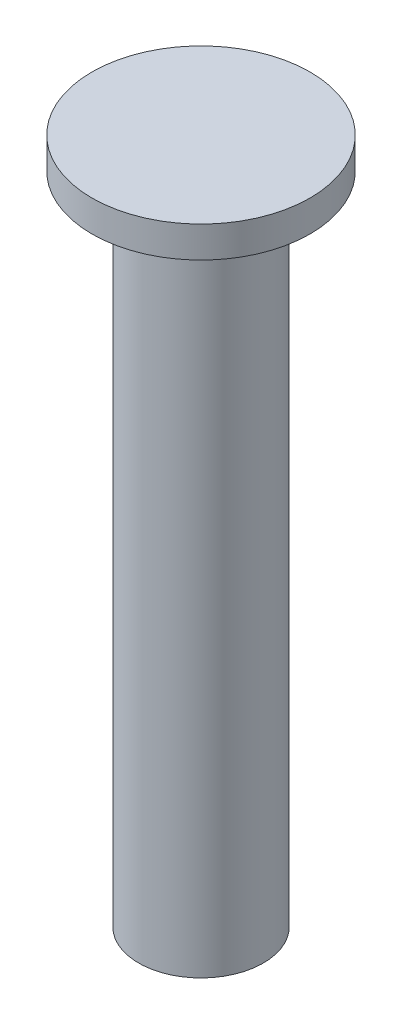
ISO-10303-21;
HEADER;
FILE_DESCRIPTION(('STEP AP214'),'2;1');
FILE_NAME('part.step','',(''),(''),'','','');
FILE_SCHEMA(('AUTOMOTIVE_DESIGN { 1 0 10303 214 1 1 1 1 }'));
ENDSEC;
DATA;
#1=APPLICATION_CONTEXT('core data for automotive mechanical design processes');
#2=APPLICATION_PROTOCOL_DEFINITION('international standard','automotive_design',2000,#1);
#3=PRODUCT_CONTEXT('',#1,'mechanical');
#4=PRODUCT('Part','Part','',(#3));
#5=PRODUCT_RELATED_PRODUCT_CATEGORY('part','',(#4));
#6=PRODUCT_DEFINITION_FORMATION('','',#4);
#7=PRODUCT_DEFINITION_CONTEXT('part definition',#1,'design');
#8=PRODUCT_DEFINITION('design','',#6,#7);
#9=PRODUCT_DEFINITION_SHAPE('','',#8);
#10=(LENGTH_UNIT() NAMED_UNIT(*) SI_UNIT(.MILLI.,.METRE.));
#11=(NAMED_UNIT(*) PLANE_ANGLE_UNIT() SI_UNIT($,.RADIAN.));
#12=(NAMED_UNIT(*) SI_UNIT($,.STERADIAN.) SOLID_ANGLE_UNIT());
#13=UNCERTAINTY_MEASURE_WITH_UNIT(LENGTH_MEASURE(1.E-05),#10,'distance_accuracy_value','');
#14=(GEOMETRIC_REPRESENTATION_CONTEXT(3) GLOBAL_UNCERTAINTY_ASSIGNED_CONTEXT((#13)) GLOBAL_UNIT_ASSIGNED_CONTEXT((#10,
#11,#12)) REPRESENTATION_CONTEXT('',''));
#15=CARTESIAN_POINT('',(0.,0.,0.));
#16=DIRECTION('',(0.,0.,1.));
#17=DIRECTION('',(1.,0.,0.));
#18=AXIS2_PLACEMENT_3D('',#15,#16,#17);
#19=CARTESIAN_POINT('',(0.,21.,0.));
#20=DIRECTION('',(0.,-1.,0.));
#21=DIRECTION('',(0.,0.,-1.));
#22=AXIS2_PLACEMENT_3D('',#19,#20,#21);
#23=CYLINDRICAL_SURFACE('',#22,2.);
#24=CARTESIAN_POINT('',(0.,21.,0.));
#25=DIRECTION('',(0.,1.,0.));
#26=DIRECTION('',(0.,0.,1.));
#27=AXIS2_PLACEMENT_3D('',#24,#25,#26);
#28=CIRCLE('',#27,2.);
#29=CARTESIAN_POINT('',(0.,21.,-2.));
#30=VERTEX_POINT('',#29);
#31=EDGE_CURVE('E10',#30,#30,#28,.T.);
#32=CARTESIAN_POINT('',(0.,0.,0.));
#33=DIRECTION('',(0.,1.,0.));
#34=DIRECTION('',(0.,0.,1.));
#35=AXIS2_PLACEMENT_3D('',#32,#33,#34);
#36=CIRCLE('',#35,2.);
#37=CARTESIAN_POINT('',(0.,0.,-2.));
#38=VERTEX_POINT('',#37);
#39=EDGE_CURVE('E40',#38,#38,#36,.T.);
#40=CARTESIAN_POINT('',(0.,21.,-2.));
#41=CARTESIAN_POINT('',(0.,20.78125,-2.));
#42=CARTESIAN_POINT('',(0.,20.5625,-2.));
#43=CARTESIAN_POINT('',(0.,20.125,-2.));
#44=CARTESIAN_POINT('',(0.,19.90625,-2.));
#45=CARTESIAN_POINT('',(0.,19.46875,-2.));
#46=CARTESIAN_POINT('',(0.,19.25,-2.));
#47=CARTESIAN_POINT('',(0.,18.8125,-2.));
#48=CARTESIAN_POINT('',(0.,18.59375,-2.));
#49=CARTESIAN_POINT('',(0.,18.15625,-2.));
#50=CARTESIAN_POINT('',(0.,17.9375,-2.));
#51=CARTESIAN_POINT('',(0.,17.5,-2.));
#52=CARTESIAN_POINT('',(0.,17.28125,-2.));
#53=CARTESIAN_POINT('',(0.,16.84375,-2.));
#54=CARTESIAN_POINT('',(0.,16.625,-2.));
#55=CARTESIAN_POINT('',(0.,16.1875,-2.));
#56=CARTESIAN_POINT('',(0.,15.96875,-2.));
#57=CARTESIAN_POINT('',(0.,15.53125,-2.));
#58=CARTESIAN_POINT('',(0.,15.3125,-2.));
#59=CARTESIAN_POINT('',(0.,14.875,-2.));
#60=CARTESIAN_POINT('',(0.,14.65625,-2.));
#61=CARTESIAN_POINT('',(0.,14.21875,-2.));
#62=CARTESIAN_POINT('',(0.,14.,-2.));
#63=CARTESIAN_POINT('',(0.,13.5625,-2.));
#64=CARTESIAN_POINT('',(0.,13.34375,-2.));
#65=CARTESIAN_POINT('',(0.,12.90625,-2.));
#66=CARTESIAN_POINT('',(0.,12.6875,-2.));
#67=CARTESIAN_POINT('',(0.,12.25,-2.));
#68=CARTESIAN_POINT('',(0.,12.03125,-2.));
#69=CARTESIAN_POINT('',(0.,11.59375,-2.));
#70=CARTESIAN_POINT('',(0.,11.375,-2.));
#71=CARTESIAN_POINT('',(0.,10.9375,-2.));
#72=CARTESIAN_POINT('',(0.,10.71875,-2.));
#73=CARTESIAN_POINT('',(0.,10.28125,-2.));
#74=CARTESIAN_POINT('',(0.,10.0625,-2.));
#75=CARTESIAN_POINT('',(0.,9.625,-2.));
#76=CARTESIAN_POINT('',(0.,9.40625,-2.));
#77=CARTESIAN_POINT('',(0.,8.96875,-2.));
#78=CARTESIAN_POINT('',(0.,8.75,-2.));
#79=CARTESIAN_POINT('',(0.,8.3125,-2.));
#80=CARTESIAN_POINT('',(0.,8.09375,-2.));
#81=CARTESIAN_POINT('',(0.,7.65625,-2.));
#82=CARTESIAN_POINT('',(0.,7.4375,-2.));
#83=CARTESIAN_POINT('',(0.,7.,-2.));
#84=CARTESIAN_POINT('',(0.,6.78125,-2.));
#85=CARTESIAN_POINT('',(0.,6.34375,-2.));
#86=CARTESIAN_POINT('',(0.,6.125,-2.));
#87=CARTESIAN_POINT('',(0.,5.6875,-2.));
#88=CARTESIAN_POINT('',(0.,5.46875,-2.));
#89=CARTESIAN_POINT('',(0.,5.03125,-2.));
#90=CARTESIAN_POINT('',(0.,4.8125,-2.));
#91=CARTESIAN_POINT('',(0.,4.375,-2.));
#92=CARTESIAN_POINT('',(0.,4.15625,-2.));
#93=CARTESIAN_POINT('',(0.,3.71875,-2.));
#94=CARTESIAN_POINT('',(0.,3.5,-2.));
#95=CARTESIAN_POINT('',(0.,3.0625,-2.));
#96=CARTESIAN_POINT('',(0.,2.84375,-2.));
#97=CARTESIAN_POINT('',(0.,2.40625,-2.));
#98=CARTESIAN_POINT('',(0.,2.1875,-2.));
#99=CARTESIAN_POINT('',(0.,1.75,-2.));
#100=CARTESIAN_POINT('',(0.,1.53125,-2.));
#101=CARTESIAN_POINT('',(0.,1.09375,-2.));
#102=CARTESIAN_POINT('',(0.,0.875000000000001,-2.));
#103=CARTESIAN_POINT('',(0.,0.4375,-2.));
#104=CARTESIAN_POINT('',(0.,0.21875,-2.));
#105=CARTESIAN_POINT('',(0.,0.,-2.));
#106=B_SPLINE_CURVE_WITH_KNOTS('',3,(#40,#41,#42,#43,#44,#45,#46,#47,#48,#49,#50,#51,#52,#53,
#54,#55,#56,#57,#58,#59,#60,#61,#62,#63,#64,#65,#66,#67,#68,#69,#70,#71,#72,#73,#74,#75,#76,#77,
#78,#79,#80,#81,#82,#83,#84,#85,#86,#87,#88,#89,#90,#91,#92,#93,#94,#95,#96,#97,#98,#99,#100,
#101,#102,#103,#104,#105),.UNSPECIFIED.,.F.,.F.,(4,2,2,2,2,2,2,2,2,2,2,2,2,2,2,2,2,2,2,2,2,2,2,
2,2,2,2,2,2,2,2,2,4),(0.,0.656250000000001,1.3125,1.96875,2.625,3.28125,3.9375,4.59375,5.25,
5.90625,6.5625,7.21875,7.875,8.53125,9.1875,9.84375,10.5,11.15625,11.8125,12.46875,13.125,
13.78125,14.4375,15.09375,15.75,16.40625,17.0625,17.71875,18.375,19.03125,19.6875,20.34375,21.),.UNSPECIFIED.);
#107=EDGE_CURVE('BSEAM37',#30,#38,#106,.T.);
#108=ORIENTED_EDGE('',*,*,#31,.F.);
#109=ORIENTED_EDGE('',*,*,#39,.T.);
#110=ORIENTED_EDGE('',*,*,#107,.T.);
#111=ORIENTED_EDGE('',*,*,#107,.F.);
#112=EDGE_LOOP('',(#108,#110,#109,#111));
#113=FACE_BOUND('',#112,.T.);
#114=ADVANCED_FACE('F37',(#113),#23,.T.);
#115=CARTESIAN_POINT('',(0.,0.,0.));
#116=DIRECTION('',(0.,1.,0.));
#117=DIRECTION('',(0.,0.,1.));
#118=AXIS2_PLACEMENT_3D('',#115,#116,#117);
#119=PLANE('',#118);
#120=ORIENTED_EDGE('',*,*,#39,.F.);
#121=EDGE_LOOP('',(#120));
#122=FACE_BOUND('',#121,.T.);
#123=ADVANCED_FACE('F64',(#122),#119,.F.);
#124=CARTESIAN_POINT('',(0.,22.,0.));
#125=DIRECTION('',(0.,-1.,0.));
#126=DIRECTION('',(0.,0.,-1.));
#127=AXIS2_PLACEMENT_3D('',#124,#125,#126);
#128=CYLINDRICAL_SURFACE('',#127,3.5);
#129=CARTESIAN_POINT('',(0.,22.,0.));
#130=DIRECTION('',(0.,1.,0.));
#131=DIRECTION('',(0.,0.,1.));
#132=AXIS2_PLACEMENT_3D('',#129,#130,#131);
#133=CIRCLE('',#132,3.5);
#134=CARTESIAN_POINT('',(0.,22.,3.5));
#135=VERTEX_POINT('',#134);
#136=EDGE_CURVE('E49',#135,#135,#133,.T.);
#137=ORIENTED_EDGE('',*,*,#136,.F.);
#138=EDGE_LOOP('',(#137));
#139=FACE_BOUND('',#138,.T.);
#140=CARTESIAN_POINT('',(0.,21.,0.));
#141=DIRECTION('',(0.,1.,0.));
#142=DIRECTION('',(0.,0.,1.));
#143=AXIS2_PLACEMENT_3D('',#140,#141,#142);
#144=CIRCLE('',#143,3.5);
#145=CARTESIAN_POINT('',(0.,21.,3.5));
#146=VERTEX_POINT('',#145);
#147=EDGE_CURVE('E51',#146,#146,#144,.T.);
#148=ORIENTED_EDGE('',*,*,#147,.T.);
#149=EDGE_LOOP('',(#148));
#150=FACE_BOUND('',#149,.T.);
#151=ADVANCED_FACE('F61',(#139,#150),#128,.T.);
#152=CARTESIAN_POINT('',(0.,22.,0.));
#153=DIRECTION('',(0.,1.,0.));
#154=DIRECTION('',(0.,0.,1.));
#155=AXIS2_PLACEMENT_3D('',#152,#153,#154);
#156=PLANE('',#155);
#157=ORIENTED_EDGE('',*,*,#136,.T.);
#158=EDGE_LOOP('',(#157));
#159=FACE_BOUND('',#158,.T.);
#160=ADVANCED_FACE('F59',(#159),#156,.T.);
#161=CARTESIAN_POINT('',(0.,21.,0.));
#162=DIRECTION('',(0.,1.,0.));
#163=DIRECTION('',(0.,0.,1.));
#164=AXIS2_PLACEMENT_3D('',#161,#162,#163);
#165=PLANE('',#164);
#166=ORIENTED_EDGE('',*,*,#31,.T.);
#167=EDGE_LOOP('',(#166));
#168=FACE_BOUND('',#167,.T.);
#169=ORIENTED_EDGE('',*,*,#147,.F.);
#170=EDGE_LOOP('',(#169));
#171=FACE_BOUND('',#170,.T.);
#172=ADVANCED_FACE('F68',(#168,#171),#165,.F.);
#173=CLOSED_SHELL('',(#114,#123,#151,#160,#172));
#174=MANIFOLD_SOLID_BREP('B2',#173);
#175=ADVANCED_BREP_SHAPE_REPRESENTATION('',(#18,#174),#14);
#176=SHAPE_DEFINITION_REPRESENTATION(#9,#175);
ENDSEC;
END-ISO-10303-21;
